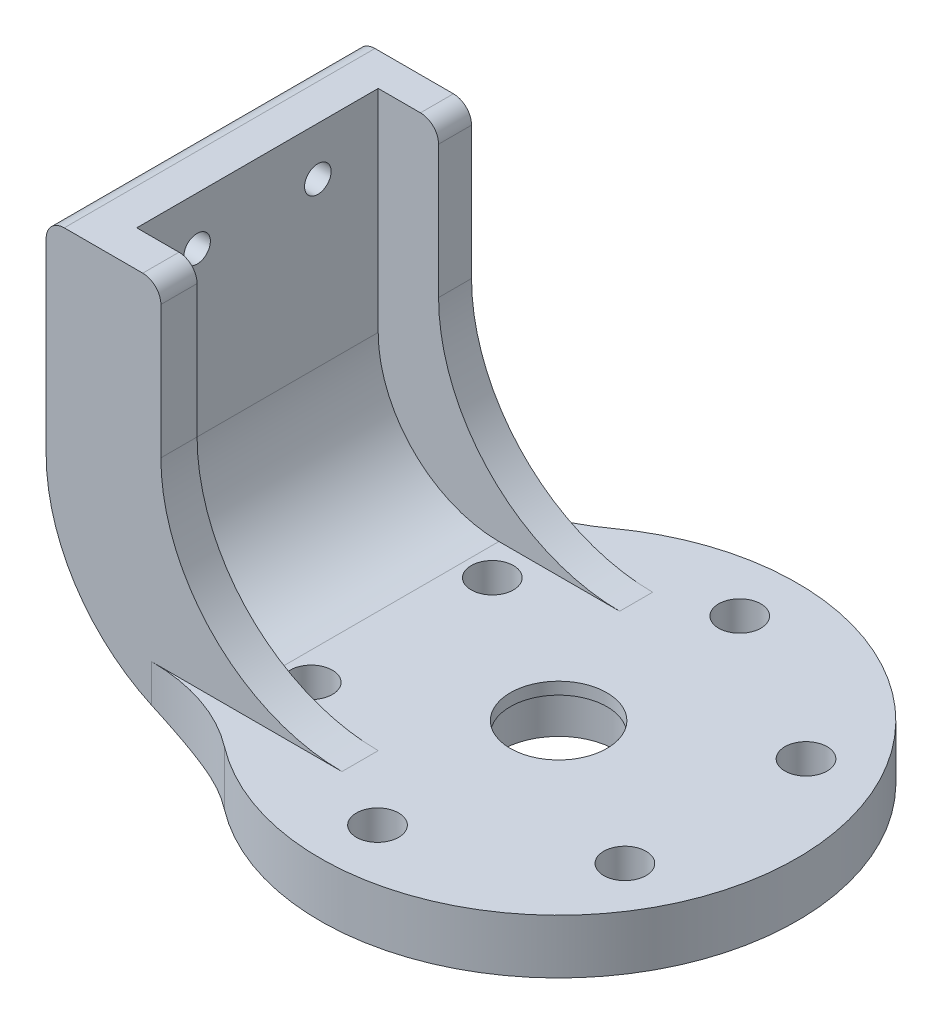
ISO-10303-21;
HEADER;
FILE_DESCRIPTION(('STEP AP214'),'2;1');
FILE_NAME('part.step','',(''),(''),'','','');
FILE_SCHEMA(('AUTOMOTIVE_DESIGN { 1 0 10303 214 1 1 1 1 }'));
ENDSEC;
DATA;
#1=APPLICATION_CONTEXT('core data for automotive mechanical design processes');
#2=APPLICATION_PROTOCOL_DEFINITION('international standard','automotive_design',2000,#1);
#3=PRODUCT_CONTEXT('',#1,'mechanical');
#4=PRODUCT('Part','Part','',(#3));
#5=PRODUCT_RELATED_PRODUCT_CATEGORY('part','',(#4));
#6=PRODUCT_DEFINITION_FORMATION('','',#4);
#7=PRODUCT_DEFINITION_CONTEXT('part definition',#1,'design');
#8=PRODUCT_DEFINITION('design','',#6,#7);
#9=PRODUCT_DEFINITION_SHAPE('','',#8);
#10=(LENGTH_UNIT() NAMED_UNIT(*) SI_UNIT(.MILLI.,.METRE.));
#11=(NAMED_UNIT(*) PLANE_ANGLE_UNIT() SI_UNIT($,.RADIAN.));
#12=(NAMED_UNIT(*) SI_UNIT($,.STERADIAN.) SOLID_ANGLE_UNIT());
#13=UNCERTAINTY_MEASURE_WITH_UNIT(LENGTH_MEASURE(1.E-05),#10,'distance_accuracy_value','');
#14=(GEOMETRIC_REPRESENTATION_CONTEXT(3) GLOBAL_UNCERTAINTY_ASSIGNED_CONTEXT((#13)) GLOBAL_UNIT_ASSIGNED_CONTEXT((#10,
#11,#12)) REPRESENTATION_CONTEXT('',''));
#15=CARTESIAN_POINT('',(0.,0.,0.));
#16=DIRECTION('',(0.,0.,1.));
#17=DIRECTION('',(1.,0.,0.));
#18=AXIS2_PLACEMENT_3D('',#15,#16,#17);
#19=CARTESIAN_POINT('',(45.9492279760976,9.,73.1158535405208));
#20=DIRECTION('',(0.,-1.,0.));
#21=DIRECTION('',(0.,0.,-1.));
#22=AXIS2_PLACEMENT_3D('',#19,#20,#21);
#23=CYLINDRICAL_SURFACE('',#22,9.52);
#24=CARTESIAN_POINT('',(45.9492279760976,0.,73.1158535405208));
#25=DIRECTION('',(0.,1.,0.));
#26=DIRECTION('',(0.,0.,1.));
#27=AXIS2_PLACEMENT_3D('',#24,#25,#26);
#28=CIRCLE('',#27,9.52);
#29=CARTESIAN_POINT('',(45.9492279760976,0.,82.6358535405208));
#30=VERTEX_POINT('',#29);
#31=EDGE_CURVE('E221',#30,#30,#28,.T.);
#32=ORIENTED_EDGE('',*,*,#31,.F.);
#33=EDGE_LOOP('',(#32));
#34=FACE_BOUND('',#33,.T.);
#35=CARTESIAN_POINT('',(45.9492279760976,7.,73.1158535405208));
#36=DIRECTION('',(0.,1.,0.));
#37=DIRECTION('',(0.,0.,1.));
#38=AXIS2_PLACEMENT_3D('',#35,#36,#37);
#39=CIRCLE('',#38,9.51999999999999);
#40=CARTESIAN_POINT('',(45.9492279760976,7.,82.6358535405208));
#41=VERTEX_POINT('',#40);
#42=EDGE_CURVE('E372',#41,#41,#39,.T.);
#43=ORIENTED_EDGE('',*,*,#42,.T.);
#44=EDGE_LOOP('',(#43));
#45=FACE_BOUND('',#44,.T.);
#46=ADVANCED_FACE('F34',(#34,#45),#23,.F.);
#47=CARTESIAN_POINT('',(3.79529264191499,9.,128.372488760558));
#48=DIRECTION('',(0.,-1.,0.));
#49=DIRECTION('',(0.,0.,-1.));
#50=AXIS2_PLACEMENT_3D('',#47,#48,#49);
#51=CYLINDRICAL_SURFACE('',#50,30.);
#52=DIRECTION('',(0.,-1.,0.));
#53=VECTOR('',#52,1.);
#54=CARTESIAN_POINT('',(3.79529264191499,9.,98.3724887605582));
#55=LINE('',#54,#53);
#56=CARTESIAN_POINT('',(3.79529264191499,9.,98.3724887605582));
#57=VERTEX_POINT('',#56);
#58=CARTESIAN_POINT('',(3.79529264191499,2.73958476161207,98.3724887605582));
#59=VERTEX_POINT('',#58);
#60=EDGE_CURVE('E225',#57,#59,#55,.T.);
#61=ORIENTED_EDGE('',*,*,#60,.T.);
#62=CARTESIAN_POINT('',(3.79529264191499,2.73958476161207,98.3724887605582));
#63=CARTESIAN_POINT('',(4.08212317001272,2.60779318026509,98.3724829941111));
#64=CARTESIAN_POINT('',(4.37104514995262,2.48053856169902,98.3766023291726));
#65=CARTESIAN_POINT('',(4.95256566151805,2.23528165272829,98.3934085599319));
#66=CARTESIAN_POINT('',(5.24516444303922,2.11727999519517,98.4060960410927));
#67=CARTESIAN_POINT('',(5.83359838933293,1.89068483693133,98.4403621543783));
#68=CARTESIAN_POINT('',(6.12943467748276,1.78209472650962,98.4619439745199));
#69=CARTESIAN_POINT('',(6.72362820041278,1.57452538424646,98.5142596795545));
#70=CARTESIAN_POINT('',(7.02198536010883,1.47554586724273,98.5449932927885));
#71=CARTESIAN_POINT('',(7.90489432426477,1.19793635092324,98.6494982864934));
#72=CARTESIAN_POINT('',(8.49227863878973,1.03288438237797,98.7364302103873));
#73=CARTESIAN_POINT('',(9.66948962433131,0.740168118970389,98.9471378247645));
#74=CARTESIAN_POINT('',(10.2593153739623,0.612490829120244,99.0709006790637));
#75=CARTESIAN_POINT('',(11.3081705297091,0.417908130600696,99.3245810629997));
#76=CARTESIAN_POINT('',(11.7676440231811,0.343820640765705,99.4472568020468));
#77=CARTESIAN_POINT('',(12.6829993440016,0.217702595368154,99.7152716444943));
#78=CARTESIAN_POINT('',(13.1388812271756,0.165671696306767,99.8606103949035));
#79=CARTESIAN_POINT('',(14.0540024531109,0.0821088691003242,100.176783994745));
#80=CARTESIAN_POINT('',(14.5131237731802,0.0510119886438955,100.348074333651));
#81=CARTESIAN_POINT('',(15.4232178697208,0.00993898451727821,100.713268494247));
#82=CARTESIAN_POINT('',(15.8741911816049,-3.85319663760539E-05,100.907170823797));
#83=CARTESIAN_POINT('',(16.3200585491353,0.,101.11207352217));
#84=B_SPLINE_CURVE_WITH_KNOTS('',3,(#62,#63,#64,#65,#66,#67,#68,#69,#70,#71,#72,#73,#74,#75,#76,
#77,#78,#79,#80,#81,#82,#83),.UNSPECIFIED.,.F.,.F.,(4,2,2,2,2,2,2,2,2,2,4),(0.,
0.946919297964487,1.89390330564701,2.84122703843126,3.788522653951,5.63502311975776,
7.48088080197917,8.92377794619328,10.3666526185896,11.8386566190141,13.3105635383484),.UNSPECIFIED.);
#85=CARTESIAN_POINT('',(16.3200585491353,0.,101.11207352217));
#86=VERTEX_POINT('',#85);
#87=EDGE_CURVE('E315',#59,#86,#84,.T.);
#88=ORIENTED_EDGE('',*,*,#87,.T.);
#89=CARTESIAN_POINT('',(3.79529264191499,0.,128.372488760558));
#90=DIRECTION('',(0.,1.,0.));
#91=DIRECTION('',(0.,0.,1.));
#92=AXIS2_PLACEMENT_3D('',#89,#90,#91);
#93=CIRCLE('',#92,30.);
#94=CARTESIAN_POINT('',(21.9912359516365,0.,104.520703773489));
#95=VERTEX_POINT('',#94);
#96=EDGE_CURVE('E216',#95,#86,#93,.T.);
#97=ORIENTED_EDGE('',*,*,#96,.F.);
#98=DIRECTION('',(0.,-1.,0.));
#99=VECTOR('',#98,1.);
#100=CARTESIAN_POINT('',(21.9912359516365,9.,104.520703773489));
#101=LINE('',#100,#99);
#102=CARTESIAN_POINT('',(21.9912359516365,9.,104.520703773489));
#103=VERTEX_POINT('',#102);
#104=EDGE_CURVE('E200',#103,#95,#101,.T.);
#105=ORIENTED_EDGE('',*,*,#104,.F.);
#106=CARTESIAN_POINT('',(3.79529264191499,9.,128.372488760558));
#107=DIRECTION('',(0.,1.,0.));
#108=DIRECTION('',(0.,0.,1.));
#109=AXIS2_PLACEMENT_3D('',#106,#107,#108);
#110=CIRCLE('',#109,30.);
#111=EDGE_CURVE('E217',#103,#57,#110,.T.);
#112=ORIENTED_EDGE('',*,*,#111,.T.);
#113=EDGE_LOOP('',(#61,#88,#97,#105,#112));
#114=FACE_BOUND('',#113,.T.);
#115=ADVANCED_FACE('F306',(#114),#51,.F.);
#116=CARTESIAN_POINT('',(45.9492279760976,9.,73.1158535405208));
#117=DIRECTION('',(0.,-1.,0.));
#118=DIRECTION('',(0.,0.,-1.));
#119=AXIS2_PLACEMENT_3D('',#116,#117,#118);
#120=CYLINDRICAL_SURFACE('',#119,39.4999999999908);
#121=CARTESIAN_POINT('',(45.9492279760976,0.,73.1158535405208));
#122=DIRECTION('',(0.,1.,0.));
#123=DIRECTION('',(0.,0.,1.));
#124=AXIS2_PLACEMENT_3D('',#121,#122,#123);
#125=CIRCLE('',#124,39.4999999999908);
#126=CARTESIAN_POINT('',(22.7153108427455,0.,41.1716037506164));
#127=VERTEX_POINT('',#126);
#128=EDGE_CURVE('E228',#95,#127,#125,.T.);
#129=ORIENTED_EDGE('',*,*,#128,.T.);
#130=DIRECTION('',(0.,-1.,0.));
#131=VECTOR('',#130,1.);
#132=CARTESIAN_POINT('',(22.7153108427455,9.,41.1716037506164));
#133=LINE('',#132,#131);
#134=CARTESIAN_POINT('',(22.7153108427455,9.,41.1716037506164));
#135=VERTEX_POINT('',#134);
#136=EDGE_CURVE('E244',#135,#127,#133,.T.);
#137=ORIENTED_EDGE('',*,*,#136,.F.);
#138=CARTESIAN_POINT('',(45.9492279760976,9.,73.1158535405208));
#139=DIRECTION('',(0.,1.,0.));
#140=DIRECTION('',(0.,0.,1.));
#141=AXIS2_PLACEMENT_3D('',#138,#139,#140);
#142=CIRCLE('',#141,39.4999999999908);
#143=EDGE_CURVE('E220',#103,#135,#142,.T.);
#144=ORIENTED_EDGE('',*,*,#143,.F.);
#145=ORIENTED_EDGE('',*,*,#104,.T.);
#146=EDGE_LOOP('',(#129,#137,#144,#145));
#147=FACE_BOUND('',#146,.T.);
#148=ADVANCED_FACE('F301',(#147),#120,.T.);
#149=CARTESIAN_POINT('',(5.06929783006886,9.,16.9101482139746));
#150=DIRECTION('',(0.,-1.,0.));
#151=DIRECTION('',(0.,0.,-1.));
#152=AXIS2_PLACEMENT_3D('',#149,#150,#151);
#153=CYLINDRICAL_SURFACE('',#152,30.);
#154=CARTESIAN_POINT('',(5.06929783006886,0.,16.9101482139746));
#155=DIRECTION('',(0.,1.,0.));
#156=DIRECTION('',(0.,0.,1.));
#157=AXIS2_PLACEMENT_3D('',#154,#155,#156);
#158=CIRCLE('',#157,30.);
#159=CARTESIAN_POINT('',(16.3200585491353,0.,44.7205848024626));
#160=VERTEX_POINT('',#159);
#161=EDGE_CURVE('E230',#127,#160,#158,.F.);
#162=ORIENTED_EDGE('',*,*,#161,.T.);
#163=CARTESIAN_POINT('',(16.3200585491353,0.,44.7205848024626));
#164=CARTESIAN_POINT('',(16.0303772510127,-6.10866229432289E-06,44.8377834352283));
#165=CARTESIAN_POINT('',(15.7388546475405,0.00419572042793232,44.9504450216047));
#166=CARTESIAN_POINT('',(15.1526416994677,0.0212903135662298,45.1665397020865));
#167=CARTESIAN_POINT('',(14.8579511606892,0.0341836133796934,45.2699722268428));
#168=CARTESIAN_POINT('',(14.2658335496683,0.0689432916229645,45.4674797585722));
#169=CARTESIAN_POINT('',(13.9684054205856,0.0908132908442439,45.561550970573));
#170=CARTESIAN_POINT('',(13.3715418801136,0.143743515662686,45.7401642093106));
#171=CARTESIAN_POINT('',(13.0721065283932,0.174803469242807,45.8247065179949));
#172=CARTESIAN_POINT('',(12.1851389942991,0.280455177399822,46.0603301386952));
#173=CARTESIAN_POINT('',(11.5954769211261,0.368297351035106,46.1978815869031));
#174=CARTESIAN_POINT('',(10.4156001881332,0.580678026048685,46.4360542820999));
#175=CARTESIAN_POINT('',(9.82538589780021,0.705199948239401,46.5366921679173));
#176=CARTESIAN_POINT('',(8.88689450454277,0.933211238148347,46.6683615180891));
#177=CARTESIAN_POINT('',(8.53729703559168,1.02484336870942,46.7110837758843));
#178=CARTESIAN_POINT('',(7.8404657795513,1.22105865387952,46.7839375632547));
#179=CARTESIAN_POINT('',(7.49323166692707,1.32563998512021,46.8140708628649));
#180=CARTESIAN_POINT('',(6.79730434534592,1.54912130588885,46.8623982873285));
#181=CARTESIAN_POINT('',(6.44865615916769,1.66819760447331,46.8804234434798));
#182=CARTESIAN_POINT('',(5.75558019241474,1.91926143034799,46.9043051803117));
#183=CARTESIAN_POINT('',(5.41115279136364,2.05125010924336,46.9101606745895));
#184=CARTESIAN_POINT('',(5.06929783006844,2.18956341151216,46.9101482139746));
#185=B_SPLINE_CURVE_WITH_KNOTS('',3,(#163,#164,#165,#166,#167,#168,#169,#170,#171,#172,#173,
#174,#175,#176,#177,#178,#179,#180,#181,#182,#183,#184),.UNSPECIFIED.,.F.,.F.,(4,2,2,2,2,2,2,2,
2,2,4),(0.,0.937413719174226,1.87488522831024,2.81273524290374,3.75055750048566,
5.58370271831508,7.41602062554984,8.50738213124042,9.5985901374314,10.7047260036722,
11.8109606119762),.UNSPECIFIED.);
#186=CARTESIAN_POINT('',(5.06929783006844,2.18956341151216,46.9101482139746));
#187=VERTEX_POINT('',#186);
#188=EDGE_CURVE('E281',#160,#187,#185,.T.);
#189=ORIENTED_EDGE('',*,*,#188,.T.);
#190=DIRECTION('',(0.,-1.,0.));
#191=VECTOR('',#190,1.);
#192=CARTESIAN_POINT('',(5.06929783006844,9.,46.9101482139746));
#193=LINE('',#192,#191);
#194=CARTESIAN_POINT('',(5.06929783006844,9.,46.9101482139746));
#195=VERTEX_POINT('',#194);
#196=EDGE_CURVE('E241',#195,#187,#193,.T.);
#197=ORIENTED_EDGE('',*,*,#196,.F.);
#198=CARTESIAN_POINT('',(5.06929783006886,9.,16.9101482139746));
#199=DIRECTION('',(0.,1.,0.));
#200=DIRECTION('',(0.,0.,1.));
#201=AXIS2_PLACEMENT_3D('',#198,#199,#200);
#202=CIRCLE('',#201,30.);
#203=EDGE_CURVE('E223',#135,#195,#202,.F.);
#204=ORIENTED_EDGE('',*,*,#203,.F.);
#205=ORIENTED_EDGE('',*,*,#136,.T.);
#206=EDGE_LOOP('',(#162,#189,#197,#204,#205));
#207=FACE_BOUND('',#206,.T.);
#208=ADVANCED_FACE('F295',(#207),#153,.F.);
#209=CARTESIAN_POINT('',(-6.42355023265449E-13,9.,46.9101482139745));
#210=DIRECTION('',(0.,0.,-1.));
#211=DIRECTION('',(-1.,0.,0.));
#212=AXIS2_PLACEMENT_3D('',#209,#210,#211);
#213=PLANE('',#212);
#214=DIRECTION('',(-1.,0.,0.));
#215=VECTOR('',#214,1.);
#216=CARTESIAN_POINT('',(-4.67994145086473,64.,46.9101482139743));
#217=LINE('',#216,#215);
#218=CARTESIAN_POINT('',(2.32005854913527,64.,46.9101482139743));
#219=VERTEX_POINT('',#218);
#220=CARTESIAN_POINT('',(-10.6799414508647,64.,46.9101482139743));
#221=VERTEX_POINT('',#220);
#222=EDGE_CURVE('E190',#219,#221,#217,.T.);
#223=ORIENTED_EDGE('',*,*,#222,.F.);
#224=CARTESIAN_POINT('',(2.32005854913527,61.,46.9101482139745));
#225=DIRECTION('',(0.,0.,-1.));
#226=DIRECTION('',(-1.,0.,0.));
#227=AXIS2_PLACEMENT_3D('',#224,#225,#226);
#228=CIRCLE('',#227,3.);
#229=CARTESIAN_POINT('',(5.32005854913527,61.,46.9101482139743));
#230=VERTEX_POINT('',#229);
#231=EDGE_CURVE('E332',#219,#230,#228,.T.);
#232=ORIENTED_EDGE('',*,*,#231,.T.);
#233=DIRECTION('',(0.,-1.,0.));
#234=VECTOR('',#233,1.);
#235=CARTESIAN_POINT('',(5.32005854913527,64.,46.9101482139743));
#236=LINE('',#235,#234);
#237=CARTESIAN_POINT('',(5.32005854913527,39.,46.9101482139743));
#238=VERTEX_POINT('',#237);
#239=EDGE_CURVE('E196',#230,#238,#236,.T.);
#240=ORIENTED_EDGE('',*,*,#239,.T.);
#241=CARTESIAN_POINT('',(35.3200585491353,39.,46.910148213975));
#242=DIRECTION('',(0.,0.,-1.));
#243=DIRECTION('',(-1.,0.,0.));
#244=AXIS2_PLACEMENT_3D('',#241,#242,#243);
#245=CIRCLE('',#244,30.);
#246=CARTESIAN_POINT('',(35.3200585491353,9.,46.9101482139743));
#247=VERTEX_POINT('',#246);
#248=EDGE_CURVE('E265',#238,#247,#245,.F.);
#249=ORIENTED_EDGE('',*,*,#248,.T.);
#250=DIRECTION('',(-1.,0.,0.));
#251=VECTOR('',#250,1.);
#252=CARTESIAN_POINT('',(-13.6799414508647,9.,46.9101482139743));
#253=LINE('',#252,#251);
#254=EDGE_CURVE('E206',#247,#195,#253,.T.);
#255=ORIENTED_EDGE('',*,*,#254,.T.);
#256=ORIENTED_EDGE('',*,*,#196,.T.);
#257=CARTESIAN_POINT('',(16.3200585491353,30.,46.9101482139747));
#258=DIRECTION('',(0.,0.,-1.));
#259=DIRECTION('',(-1.,0.,0.));
#260=AXIS2_PLACEMENT_3D('',#257,#258,#259);
#261=CIRCLE('',#260,30.);
#262=CARTESIAN_POINT('',(-13.6799414508647,30.,46.9101482139743));
#263=VERTEX_POINT('',#262);
#264=EDGE_CURVE('E289',#187,#263,#261,.T.);
#265=ORIENTED_EDGE('',*,*,#264,.T.);
#266=DIRECTION('',(0.,-1.,0.));
#267=VECTOR('',#266,1.);
#268=CARTESIAN_POINT('',(-13.6799414508647,9.,46.9101482139743));
#269=LINE('',#268,#267);
#270=CARTESIAN_POINT('',(-13.6799414508647,61.,46.9101482139743));
#271=VERTEX_POINT('',#270);
#272=EDGE_CURVE('E239',#271,#263,#269,.T.);
#273=ORIENTED_EDGE('',*,*,#272,.F.);
#274=CARTESIAN_POINT('',(-10.6799414508647,61.,46.9101482139744));
#275=DIRECTION('',(0.,0.,-1.));
#276=DIRECTION('',(-1.,0.,0.));
#277=AXIS2_PLACEMENT_3D('',#274,#275,#276);
#278=CIRCLE('',#277,3.);
#279=EDGE_CURVE('E330',#271,#221,#278,.T.);
#280=ORIENTED_EDGE('',*,*,#279,.T.);
#281=EDGE_LOOP('',(#223,#232,#240,#249,#255,#256,#265,#273,#280));
#282=FACE_BOUND('',#281,.T.);
#283=ADVANCED_FACE('F300',(#282),#213,.T.);
#284=CARTESIAN_POINT('',(-13.6799414508647,9.,0.));
#285=DIRECTION('',(-1.,0.,0.));
#286=DIRECTION('',(0.,0.,1.));
#287=AXIS2_PLACEMENT_3D('',#284,#285,#286);
#288=PLANE('',#287);
#289=CARTESIAN_POINT('',(-13.6799414508647,56.,82.3724887605582));
#290=DIRECTION('',(-1.,0.,0.));
#291=DIRECTION('',(0.,0.,1.));
#292=AXIS2_PLACEMENT_3D('',#289,#290,#291);
#293=CIRCLE('',#292,2.2);
#294=CARTESIAN_POINT('',(-13.6799414508647,56.,84.5724887605582));
#295=VERTEX_POINT('',#294);
#296=EDGE_CURVE('E204',#295,#295,#293,.T.);
#297=ORIENTED_EDGE('',*,*,#296,.F.);
#298=EDGE_LOOP('',(#297));
#299=FACE_BOUND('',#298,.T.);
#300=CARTESIAN_POINT('',(-13.6799414508647,56.,62.3724887605582));
#301=DIRECTION('',(-1.,0.,0.));
#302=DIRECTION('',(0.,0.,1.));
#303=AXIS2_PLACEMENT_3D('',#300,#301,#302);
#304=CIRCLE('',#303,2.2);
#305=CARTESIAN_POINT('',(-13.6799414508647,56.,64.5724887605582));
#306=VERTEX_POINT('',#305);
#307=EDGE_CURVE('E365',#306,#306,#304,.T.);
#308=ORIENTED_EDGE('',*,*,#307,.F.);
#309=EDGE_LOOP('',(#308));
#310=FACE_BOUND('',#309,.T.);
#311=DIRECTION('',(0.,-1.,0.));
#312=VECTOR('',#311,1.);
#313=CARTESIAN_POINT('',(-13.6799414508647,9.,98.3724887605582));
#314=LINE('',#313,#312);
#315=CARTESIAN_POINT('',(-13.6799414508647,61.,98.3724887605582));
#316=VERTEX_POINT('',#315);
#317=CARTESIAN_POINT('',(-13.6799414508647,30.,98.3724887605582));
#318=VERTEX_POINT('',#317);
#319=EDGE_CURVE('E237',#316,#318,#314,.T.);
#320=ORIENTED_EDGE('',*,*,#319,.F.);
#321=DIRECTION('',(0.,0.,1.));
#322=VECTOR('',#321,1.);
#323=CARTESIAN_POINT('',(-13.6799414508647,61.,0.));
#324=LINE('',#323,#322);
#325=EDGE_CURVE('E342',#316,#271,#324,.F.);
#326=ORIENTED_EDGE('',*,*,#325,.T.);
#327=ORIENTED_EDGE('',*,*,#272,.T.);
#328=DIRECTION('',(0.,0.,-1.));
#329=VECTOR('',#328,1.);
#330=CARTESIAN_POINT('',(-13.6799414508647,30.,98.3724887605582));
#331=LINE('',#330,#329);
#332=EDGE_CURVE('E655',#263,#318,#331,.F.);
#333=ORIENTED_EDGE('',*,*,#332,.T.);
#334=EDGE_LOOP('',(#320,#326,#327,#333));
#335=FACE_BOUND('',#334,.T.);
#336=ADVANCED_FACE('F347',(#299,#310,#335),#288,.T.);
#337=CARTESIAN_POINT('',(0.,9.,98.3724887605582));
#338=DIRECTION('',(0.,0.,-1.));
#339=DIRECTION('',(-1.,0.,0.));
#340=AXIS2_PLACEMENT_3D('',#337,#338,#339);
#341=PLANE('',#340);
#342=DIRECTION('',(1.,0.,0.));
#343=VECTOR('',#342,1.);
#344=CARTESIAN_POINT('',(-13.6799414508647,64.,98.3724887605582));
#345=LINE('',#344,#343);
#346=CARTESIAN_POINT('',(-10.6799414508647,64.,98.3724887605582));
#347=VERTEX_POINT('',#346);
#348=CARTESIAN_POINT('',(2.32005854913527,64.,98.3724887605582));
#349=VERTEX_POINT('',#348);
#350=EDGE_CURVE('E171',#347,#349,#345,.T.);
#351=ORIENTED_EDGE('',*,*,#350,.F.);
#352=CARTESIAN_POINT('',(-10.6799414508647,61.,98.3724887605582));
#353=DIRECTION('',(0.,0.,-1.));
#354=DIRECTION('',(-1.,0.,0.));
#355=AXIS2_PLACEMENT_3D('',#352,#353,#354);
#356=CIRCLE('',#355,3.);
#357=EDGE_CURVE('E340',#347,#316,#356,.F.);
#358=ORIENTED_EDGE('',*,*,#357,.T.);
#359=ORIENTED_EDGE('',*,*,#319,.T.);
#360=CARTESIAN_POINT('',(16.3200585491353,30.,98.3724887605582));
#361=DIRECTION('',(0.,0.,-1.));
#362=DIRECTION('',(-1.,0.,0.));
#363=AXIS2_PLACEMENT_3D('',#360,#361,#362);
#364=CIRCLE('',#363,30.);
#365=EDGE_CURVE('E322',#318,#59,#364,.F.);
#366=ORIENTED_EDGE('',*,*,#365,.T.);
#367=ORIENTED_EDGE('',*,*,#60,.F.);
#368=DIRECTION('',(1.,0.,0.));
#369=VECTOR('',#368,1.);
#370=CARTESIAN_POINT('',(-4.67994145086473,9.,98.3724887605582));
#371=LINE('',#370,#369);
#372=CARTESIAN_POINT('',(35.3200585491353,9.,98.3724887605582));
#373=VERTEX_POINT('',#372);
#374=EDGE_CURVE('E197',#57,#373,#371,.T.);
#375=ORIENTED_EDGE('',*,*,#374,.T.);
#376=CARTESIAN_POINT('',(35.3200585491353,39.,98.3724887605582));
#377=DIRECTION('',(0.,0.,-1.));
#378=DIRECTION('',(-1.,0.,0.));
#379=AXIS2_PLACEMENT_3D('',#376,#377,#378);
#380=CIRCLE('',#379,30.);
#381=CARTESIAN_POINT('',(5.32005854913527,39.,98.3724887605582));
#382=VERTEX_POINT('',#381);
#383=EDGE_CURVE('E262',#373,#382,#380,.T.);
#384=ORIENTED_EDGE('',*,*,#383,.T.);
#385=DIRECTION('',(0.,-1.,0.));
#386=VECTOR('',#385,1.);
#387=CARTESIAN_POINT('',(5.32005854913527,64.,98.3724887605582));
#388=LINE('',#387,#386);
#389=CARTESIAN_POINT('',(5.32005854913527,61.,98.3724887605582));
#390=VERTEX_POINT('',#389);
#391=EDGE_CURVE('E214',#390,#382,#388,.T.);
#392=ORIENTED_EDGE('',*,*,#391,.F.);
#393=CARTESIAN_POINT('',(2.32005854913527,61.,98.3724887605582));
#394=DIRECTION('',(0.,0.,-1.));
#395=DIRECTION('',(-1.,0.,0.));
#396=AXIS2_PLACEMENT_3D('',#393,#394,#395);
#397=CIRCLE('',#396,3.);
#398=EDGE_CURVE('E338',#390,#349,#397,.F.);
#399=ORIENTED_EDGE('',*,*,#398,.T.);
#400=EDGE_LOOP('',(#351,#358,#359,#366,#367,#375,#384,#392,#399));
#401=FACE_BOUND('',#400,.T.);
#402=ADVANCED_FACE('F360',(#401),#341,.F.);
#403=CARTESIAN_POINT('',(0.,9.,0.));
#404=DIRECTION('',(0.,1.,0.));
#405=DIRECTION('',(0.,0.,1.));
#406=AXIS2_PLACEMENT_3D('',#403,#404,#405);
#407=PLANE('',#406);
#408=CARTESIAN_POINT('',(19.9684658625652,9.,58.1158535405209));
#409=DIRECTION('',(0.,1.,0.));
#410=DIRECTION('',(0.,0.,1.));
#411=AXIS2_PLACEMENT_3D('',#408,#409,#410);
#412=CIRCLE('',#411,3.5);
#413=CARTESIAN_POINT('',(19.9684658625652,9.,61.6158535405209));
#414=VERTEX_POINT('',#413);
#415=EDGE_CURVE('E381',#414,#414,#412,.T.);
#416=ORIENTED_EDGE('',*,*,#415,.F.);
#417=EDGE_LOOP('',(#416));
#418=FACE_BOUND('',#417,.T.);
#419=CARTESIAN_POINT('',(45.9492279760977,9.,43.1158535405208));
#420=DIRECTION('',(0.,1.,0.));
#421=DIRECTION('',(0.,0.,1.));
#422=AXIS2_PLACEMENT_3D('',#419,#420,#421);
#423=CIRCLE('',#422,3.49999999999979);
#424=CARTESIAN_POINT('',(45.9492279760977,9.,46.6158535405206));
#425=VERTEX_POINT('',#424);
#426=EDGE_CURVE('E386',#425,#425,#423,.T.);
#427=ORIENTED_EDGE('',*,*,#426,.F.);
#428=EDGE_LOOP('',(#427));
#429=FACE_BOUND('',#428,.T.);
#430=CARTESIAN_POINT('',(71.9299900896308,9.,58.1158535405209));
#431=DIRECTION('',(0.,1.,0.));
#432=DIRECTION('',(0.,0.,1.));
#433=AXIS2_PLACEMENT_3D('',#430,#431,#432);
#434=CIRCLE('',#433,3.49999999999891);
#435=CARTESIAN_POINT('',(71.9299900896308,9.,61.6158535405198));
#436=VERTEX_POINT('',#435);
#437=EDGE_CURVE('E389',#436,#436,#434,.T.);
#438=ORIENTED_EDGE('',*,*,#437,.F.);
#439=EDGE_LOOP('',(#438));
#440=FACE_BOUND('',#439,.T.);
#441=CARTESIAN_POINT('',(71.9299900896306,9.,88.1158535405209));
#442=DIRECTION('',(0.,1.,0.));
#443=DIRECTION('',(0.,0.,1.));
#444=AXIS2_PLACEMENT_3D('',#441,#442,#443);
#445=CIRCLE('',#444,3.49999999999869);
#446=CARTESIAN_POINT('',(71.9299900896306,9.,91.6158535405196));
#447=VERTEX_POINT('',#446);
#448=EDGE_CURVE('E392',#447,#447,#445,.T.);
#449=ORIENTED_EDGE('',*,*,#448,.F.);
#450=EDGE_LOOP('',(#449));
#451=FACE_BOUND('',#450,.T.);
#452=CARTESIAN_POINT('',(45.949227976097,9.,103.115853540522));
#453=DIRECTION('',(0.,1.,0.));
#454=DIRECTION('',(0.,0.,1.));
#455=AXIS2_PLACEMENT_3D('',#452,#453,#454);
#456=CIRCLE('',#455,3.5);
#457=CARTESIAN_POINT('',(45.949227976097,9.,106.615853540522));
#458=VERTEX_POINT('',#457);
#459=EDGE_CURVE('E395',#458,#458,#456,.T.);
#460=ORIENTED_EDGE('',*,*,#459,.F.);
#461=EDGE_LOOP('',(#460));
#462=FACE_BOUND('',#461,.T.);
#463=CARTESIAN_POINT('',(19.9684658625643,9.,88.1158535405206));
#464=DIRECTION('',(0.,1.,0.));
#465=DIRECTION('',(0.,0.,1.));
#466=AXIS2_PLACEMENT_3D('',#463,#464,#465);
#467=CIRCLE('',#466,3.5);
#468=CARTESIAN_POINT('',(19.9684658625643,9.,91.6158535405206));
#469=VERTEX_POINT('',#468);
#470=EDGE_CURVE('E398',#469,#469,#467,.T.);
#471=ORIENTED_EDGE('',*,*,#470,.F.);
#472=EDGE_LOOP('',(#471));
#473=FACE_BOUND('',#472,.T.);
#474=DIRECTION('',(1.,0.,0.));
#475=VECTOR('',#474,1.);
#476=CARTESIAN_POINT('',(-4.67994145086474,9.,52.3724887605582));
#477=LINE('',#476,#475);
#478=CARTESIAN_POINT('',(15.3200585491353,9.,52.3724887605582));
#479=VERTEX_POINT('',#478);
#480=CARTESIAN_POINT('',(35.3200585491353,9.,52.3724887605582));
#481=VERTEX_POINT('',#480);
#482=EDGE_CURVE('E203',#479,#481,#477,.T.);
#483=ORIENTED_EDGE('',*,*,#482,.F.);
#484=DIRECTION('',(0.,0.,-1.));
#485=VECTOR('',#484,1.);
#486=CARTESIAN_POINT('',(15.3200585491353,9.,0.));
#487=LINE('',#486,#485);
#488=CARTESIAN_POINT('',(15.3200585491353,9.,92.3724887605582));
#489=VERTEX_POINT('',#488);
#490=EDGE_CURVE('E275',#479,#489,#487,.F.);
#491=ORIENTED_EDGE('',*,*,#490,.T.);
#492=DIRECTION('',(-1.,0.,0.));
#493=VECTOR('',#492,1.);
#494=CARTESIAN_POINT('',(-4.67994145086473,9.,92.3724887605582));
#495=LINE('',#494,#493);
#496=CARTESIAN_POINT('',(35.3200585491353,9.,92.3724887605582));
#497=VERTEX_POINT('',#496);
#498=EDGE_CURVE('E201',#497,#489,#495,.T.);
#499=ORIENTED_EDGE('',*,*,#498,.F.);
#500=DIRECTION('',(0.,0.,-1.));
#501=VECTOR('',#500,1.);
#502=CARTESIAN_POINT('',(35.3200585491353,9.,0.));
#503=LINE('',#502,#501);
#504=EDGE_CURVE('E253',#497,#373,#503,.F.);
#505=ORIENTED_EDGE('',*,*,#504,.T.);
#506=ORIENTED_EDGE('',*,*,#374,.F.);
#507=ORIENTED_EDGE('',*,*,#111,.F.);
#508=ORIENTED_EDGE('',*,*,#143,.T.);
#509=ORIENTED_EDGE('',*,*,#203,.T.);
#510=ORIENTED_EDGE('',*,*,#254,.F.);
#511=DIRECTION('',(0.,0.,-1.));
#512=VECTOR('',#511,1.);
#513=CARTESIAN_POINT('',(35.3200585491353,9.,0.));
#514=LINE('',#513,#512);
#515=EDGE_CURVE('E250',#247,#481,#514,.F.);
#516=ORIENTED_EDGE('',*,*,#515,.T.);
#517=EDGE_LOOP('',(#483,#491,#499,#505,#506,#507,#508,#509,#510,#516));
#518=FACE_BOUND('',#517,.T.);
#519=CARTESIAN_POINT('',(45.9492279760976,9.,73.1158535405208));
#520=DIRECTION('',(0.,1.,0.));
#521=DIRECTION('',(0.,0.,1.));
#522=AXIS2_PLACEMENT_3D('',#519,#520,#521);
#523=CIRCLE('',#522,8.);
#524=CARTESIAN_POINT('',(45.9492279760976,9.,81.1158535405208));
#525=VERTEX_POINT('',#524);
#526=EDGE_CURVE('E378',#525,#525,#523,.T.);
#527=ORIENTED_EDGE('',*,*,#526,.F.);
#528=EDGE_LOOP('',(#527));
#529=FACE_BOUND('',#528,.T.);
#530=ADVANCED_FACE('F426',(#418,#429,#440,#451,#462,#473,#518,#529),#407,.T.);
#531=CARTESIAN_POINT('',(0.,0.,0.));
#532=DIRECTION('',(0.,1.,0.));
#533=DIRECTION('',(0.,0.,1.));
#534=AXIS2_PLACEMENT_3D('',#531,#532,#533);
#535=PLANE('',#534);
#536=CARTESIAN_POINT('',(19.9684658625652,0.,58.1158535405209));
#537=DIRECTION('',(0.,-1.,0.));
#538=DIRECTION('',(0.,0.,-1.));
#539=AXIS2_PLACEMENT_3D('',#536,#537,#538);
#540=CIRCLE('',#539,3.5);
#541=CARTESIAN_POINT('',(19.9684658625652,0.,54.6158535405209));
#542=VERTEX_POINT('',#541);
#543=EDGE_CURVE('E405',#542,#542,#540,.T.);
#544=ORIENTED_EDGE('',*,*,#543,.F.);
#545=EDGE_LOOP('',(#544));
#546=FACE_BOUND('',#545,.T.);
#547=CARTESIAN_POINT('',(45.9492279760977,0.,43.1158535405208));
#548=DIRECTION('',(0.,-1.,0.));
#549=DIRECTION('',(0.,0.,-1.));
#550=AXIS2_PLACEMENT_3D('',#547,#548,#549);
#551=CIRCLE('',#550,3.49999999999979);
#552=CARTESIAN_POINT('',(45.9492279760977,0.,39.615853540521));
#553=VERTEX_POINT('',#552);
#554=EDGE_CURVE('E408',#553,#553,#551,.T.);
#555=ORIENTED_EDGE('',*,*,#554,.F.);
#556=EDGE_LOOP('',(#555));
#557=FACE_BOUND('',#556,.T.);
#558=CARTESIAN_POINT('',(71.9299900896308,0.,58.1158535405209));
#559=DIRECTION('',(0.,-1.,0.));
#560=DIRECTION('',(0.,0.,-1.));
#561=AXIS2_PLACEMENT_3D('',#558,#559,#560);
#562=CIRCLE('',#561,3.49999999999891);
#563=CARTESIAN_POINT('',(71.9299900896308,0.,54.615853540522));
#564=VERTEX_POINT('',#563);
#565=EDGE_CURVE('E411',#564,#564,#562,.T.);
#566=ORIENTED_EDGE('',*,*,#565,.F.);
#567=EDGE_LOOP('',(#566));
#568=FACE_BOUND('',#567,.T.);
#569=CARTESIAN_POINT('',(71.9299900896306,0.,88.1158535405209));
#570=DIRECTION('',(0.,-1.,0.));
#571=DIRECTION('',(0.,0.,-1.));
#572=AXIS2_PLACEMENT_3D('',#569,#570,#571);
#573=CIRCLE('',#572,3.49999999999869);
#574=CARTESIAN_POINT('',(71.9299900896306,0.,84.6158535405223));
#575=VERTEX_POINT('',#574);
#576=EDGE_CURVE('E414',#575,#575,#573,.T.);
#577=ORIENTED_EDGE('',*,*,#576,.F.);
#578=EDGE_LOOP('',(#577));
#579=FACE_BOUND('',#578,.T.);
#580=CARTESIAN_POINT('',(45.949227976097,0.,103.115853540522));
#581=DIRECTION('',(0.,-1.,0.));
#582=DIRECTION('',(0.,0.,-1.));
#583=AXIS2_PLACEMENT_3D('',#580,#581,#582);
#584=CIRCLE('',#583,3.5);
#585=CARTESIAN_POINT('',(45.949227976097,0.,99.6158535405215));
#586=VERTEX_POINT('',#585);
#587=EDGE_CURVE('E404',#586,#586,#584,.T.);
#588=ORIENTED_EDGE('',*,*,#587,.F.);
#589=EDGE_LOOP('',(#588));
#590=FACE_BOUND('',#589,.T.);
#591=CARTESIAN_POINT('',(19.9684658625643,0.,88.1158535405206));
#592=DIRECTION('',(0.,-1.,0.));
#593=DIRECTION('',(0.,0.,-1.));
#594=AXIS2_PLACEMENT_3D('',#591,#592,#593);
#595=CIRCLE('',#594,3.5);
#596=CARTESIAN_POINT('',(19.9684658625643,0.,84.6158535405206));
#597=VERTEX_POINT('',#596);
#598=EDGE_CURVE('E401',#597,#597,#595,.T.);
#599=ORIENTED_EDGE('',*,*,#598,.F.);
#600=EDGE_LOOP('',(#599));
#601=FACE_BOUND('',#600,.T.);
#602=ORIENTED_EDGE('',*,*,#96,.T.);
#603=DIRECTION('',(0.,0.,-1.));
#604=VECTOR('',#603,1.);
#605=CARTESIAN_POINT('',(16.3200585491353,0.,46.9101482139743));
#606=LINE('',#605,#604);
#607=EDGE_CURVE('E278',#86,#160,#606,.T.);
#608=ORIENTED_EDGE('',*,*,#607,.T.);
#609=ORIENTED_EDGE('',*,*,#161,.F.);
#610=ORIENTED_EDGE('',*,*,#128,.F.);
#611=EDGE_LOOP('',(#602,#608,#609,#610));
#612=FACE_BOUND('',#611,.T.);
#613=ORIENTED_EDGE('',*,*,#31,.T.);
#614=EDGE_LOOP('',(#613));
#615=FACE_BOUND('',#614,.T.);
#616=ADVANCED_FACE('F422',(#546,#557,#568,#579,#590,#601,#612,#615),#535,.F.);
#617=CARTESIAN_POINT('',(5.32005854913527,64.,98.3724887605582));
#618=DIRECTION('',(-1.,0.,0.));
#619=DIRECTION('',(0.,0.,1.));
#620=AXIS2_PLACEMENT_3D('',#617,#618,#619);
#621=PLANE('',#620);
#622=DIRECTION('',(0.,-1.,0.));
#623=VECTOR('',#622,1.);
#624=CARTESIAN_POINT('',(5.32005854913527,64.,92.3724887605582));
#625=LINE('',#624,#623);
#626=CARTESIAN_POINT('',(5.32005854913527,61.,92.3724887605582));
#627=VERTEX_POINT('',#626);
#628=CARTESIAN_POINT('',(5.32005854913527,39.,92.3724887605582));
#629=VERTEX_POINT('',#628);
#630=EDGE_CURVE('E182',#627,#629,#625,.T.);
#631=ORIENTED_EDGE('',*,*,#630,.F.);
#632=DIRECTION('',(0.,0.,-1.));
#633=VECTOR('',#632,1.);
#634=CARTESIAN_POINT('',(5.32005854913527,61.,98.3724887605582));
#635=LINE('',#634,#633);
#636=EDGE_CURVE('E11',#627,#390,#635,.F.);
#637=ORIENTED_EDGE('',*,*,#636,.T.);
#638=ORIENTED_EDGE('',*,*,#391,.T.);
#639=DIRECTION('',(0.,0.,-1.));
#640=VECTOR('',#639,1.);
#641=CARTESIAN_POINT('',(5.32005854913527,39.,98.3724887605582));
#642=LINE('',#641,#640);
#643=EDGE_CURVE('E199',#382,#629,#642,.T.);
#644=ORIENTED_EDGE('',*,*,#643,.T.);
#645=EDGE_LOOP('',(#631,#637,#638,#644));
#646=FACE_BOUND('',#645,.T.);
#647=ADVANCED_FACE('F425',(#646),#621,.F.);
#648=CARTESIAN_POINT('',(-4.67994145086473,64.,92.3724887605582));
#649=DIRECTION('',(0.,0.,1.));
#650=DIRECTION('',(1.,0.,0.));
#651=AXIS2_PLACEMENT_3D('',#648,#649,#650);
#652=PLANE('',#651);
#653=DIRECTION('',(-1.,0.,0.));
#654=VECTOR('',#653,1.);
#655=CARTESIAN_POINT('',(-4.67994145086473,64.,92.3724887605582));
#656=LINE('',#655,#654);
#657=CARTESIAN_POINT('',(2.32005854913527,64.,92.3724887605582));
#658=VERTEX_POINT('',#657);
#659=CARTESIAN_POINT('',(-4.67994145086473,64.,92.3724887605582));
#660=VERTEX_POINT('',#659);
#661=EDGE_CURVE('E161',#658,#660,#656,.T.);
#662=ORIENTED_EDGE('',*,*,#661,.F.);
#663=CARTESIAN_POINT('',(2.32005854913527,61.,92.3724887605582));
#664=DIRECTION('',(0.,0.,1.));
#665=DIRECTION('',(1.,0.,0.));
#666=AXIS2_PLACEMENT_3D('',#663,#664,#665);
#667=CIRCLE('',#666,3.);
#668=EDGE_CURVE('E42',#658,#627,#667,.F.);
#669=ORIENTED_EDGE('',*,*,#668,.T.);
#670=ORIENTED_EDGE('',*,*,#630,.T.);
#671=CARTESIAN_POINT('',(35.3200585491353,39.,92.3724887605582));
#672=DIRECTION('',(0.,0.,1.));
#673=DIRECTION('',(1.,0.,0.));
#674=AXIS2_PLACEMENT_3D('',#671,#672,#673);
#675=CIRCLE('',#674,30.);
#676=EDGE_CURVE('E259',#629,#497,#675,.T.);
#677=ORIENTED_EDGE('',*,*,#676,.T.);
#678=ORIENTED_EDGE('',*,*,#498,.T.);
#679=CARTESIAN_POINT('',(15.3200585491353,29.,92.3724887605582));
#680=DIRECTION('',(0.,0.,1.));
#681=DIRECTION('',(1.,0.,0.));
#682=AXIS2_PLACEMENT_3D('',#679,#680,#681);
#683=CIRCLE('',#682,20.);
#684=CARTESIAN_POINT('',(-4.67994145086473,29.,92.3724887605582));
#685=VERTEX_POINT('',#684);
#686=EDGE_CURVE('E178',#489,#685,#683,.F.);
#687=ORIENTED_EDGE('',*,*,#686,.T.);
#688=DIRECTION('',(0.,-1.,0.));
#689=VECTOR('',#688,1.);
#690=CARTESIAN_POINT('',(-4.67994145086473,64.,92.3724887605582));
#691=LINE('',#690,#689);
#692=EDGE_CURVE('E174',#660,#685,#691,.T.);
#693=ORIENTED_EDGE('',*,*,#692,.F.);
#694=EDGE_LOOP('',(#662,#669,#670,#677,#678,#687,#693));
#695=FACE_BOUND('',#694,.T.);
#696=ADVANCED_FACE('F175',(#695),#652,.F.);
#697=CARTESIAN_POINT('',(-4.67994145086474,64.,52.3724887605582));
#698=DIRECTION('',(-1.,0.,0.));
#699=DIRECTION('',(0.,0.,1.));
#700=AXIS2_PLACEMENT_3D('',#697,#698,#699);
#701=PLANE('',#700);
#702=CARTESIAN_POINT('',(-4.67994145086473,56.,82.3724887605582));
#703=DIRECTION('',(1.,0.,0.));
#704=DIRECTION('',(0.,0.,-1.));
#705=AXIS2_PLACEMENT_3D('',#702,#703,#704);
#706=CIRCLE('',#705,2.2);
#707=CARTESIAN_POINT('',(-4.67994145086473,56.,80.1724887605582));
#708=VERTEX_POINT('',#707);
#709=EDGE_CURVE('E368',#708,#708,#706,.T.);
#710=ORIENTED_EDGE('',*,*,#709,.F.);
#711=EDGE_LOOP('',(#710));
#712=FACE_BOUND('',#711,.T.);
#713=CARTESIAN_POINT('',(-4.67994145086473,56.,62.3724887605582));
#714=DIRECTION('',(1.,0.,0.));
#715=DIRECTION('',(0.,0.,-1.));
#716=AXIS2_PLACEMENT_3D('',#713,#714,#715);
#717=CIRCLE('',#716,2.2);
#718=CARTESIAN_POINT('',(-4.67994145086473,56.,60.1724887605582));
#719=VERTEX_POINT('',#718);
#720=EDGE_CURVE('E369',#719,#719,#717,.T.);
#721=ORIENTED_EDGE('',*,*,#720,.F.);
#722=EDGE_LOOP('',(#721));
#723=FACE_BOUND('',#722,.T.);
#724=ORIENTED_EDGE('',*,*,#692,.T.);
#725=DIRECTION('',(0.,0.,-1.));
#726=VECTOR('',#725,1.);
#727=CARTESIAN_POINT('',(-4.67994145086474,29.,52.3724887605582));
#728=LINE('',#727,#726);
#729=CARTESIAN_POINT('',(-4.67994145086474,29.,52.3724887605582));
#730=VERTEX_POINT('',#729);
#731=EDGE_CURVE('E271',#685,#730,#728,.T.);
#732=ORIENTED_EDGE('',*,*,#731,.T.);
#733=DIRECTION('',(0.,-1.,0.));
#734=VECTOR('',#733,1.);
#735=CARTESIAN_POINT('',(-4.67994145086474,64.,52.3724887605582));
#736=LINE('',#735,#734);
#737=CARTESIAN_POINT('',(-4.67994145086474,64.,52.3724887605582));
#738=VERTEX_POINT('',#737);
#739=EDGE_CURVE('E183',#738,#730,#736,.T.);
#740=ORIENTED_EDGE('',*,*,#739,.F.);
#741=DIRECTION('',(0.,0.,-1.));
#742=VECTOR('',#741,1.);
#743=CARTESIAN_POINT('',(-4.67994145086474,64.,52.3724887605582));
#744=LINE('',#743,#742);
#745=EDGE_CURVE('E166',#660,#738,#744,.T.);
#746=ORIENTED_EDGE('',*,*,#745,.F.);
#747=EDGE_LOOP('',(#724,#732,#740,#746));
#748=FACE_BOUND('',#747,.T.);
#749=ADVANCED_FACE('F185',(#712,#723,#748),#701,.F.);
#750=CARTESIAN_POINT('',(-4.67994145086474,64.,52.3724887605582));
#751=DIRECTION('',(0.,0.,-1.));
#752=DIRECTION('',(-1.,0.,0.));
#753=AXIS2_PLACEMENT_3D('',#750,#751,#752);
#754=PLANE('',#753);
#755=DIRECTION('',(0.,-1.,0.));
#756=VECTOR('',#755,1.);
#757=CARTESIAN_POINT('',(5.32005854913527,64.,52.3724887605582));
#758=LINE('',#757,#756);
#759=CARTESIAN_POINT('',(5.32005854913527,61.,52.3724887605582));
#760=VERTEX_POINT('',#759);
#761=CARTESIAN_POINT('',(5.32005854913527,39.,52.3724887605582));
#762=VERTEX_POINT('',#761);
#763=EDGE_CURVE('E210',#760,#762,#758,.T.);
#764=ORIENTED_EDGE('',*,*,#763,.F.);
#765=CARTESIAN_POINT('',(2.32005854913527,61.,52.3724887605582));
#766=DIRECTION('',(0.,0.,-1.));
#767=DIRECTION('',(-1.,0.,0.));
#768=AXIS2_PLACEMENT_3D('',#765,#766,#767);
#769=CIRCLE('',#768,3.);
#770=CARTESIAN_POINT('',(2.32005854913527,64.,52.3724887605582));
#771=VERTEX_POINT('',#770);
#772=EDGE_CURVE('E336',#760,#771,#769,.F.);
#773=ORIENTED_EDGE('',*,*,#772,.T.);
#774=DIRECTION('',(1.,0.,0.));
#775=VECTOR('',#774,1.);
#776=CARTESIAN_POINT('',(-4.67994145086474,64.,52.3724887605582));
#777=LINE('',#776,#775);
#778=EDGE_CURVE('E188',#738,#771,#777,.T.);
#779=ORIENTED_EDGE('',*,*,#778,.F.);
#780=ORIENTED_EDGE('',*,*,#739,.T.);
#781=CARTESIAN_POINT('',(15.3200585491353,29.,52.3724887605582));
#782=DIRECTION('',(0.,0.,-1.));
#783=DIRECTION('',(-1.,0.,0.));
#784=AXIS2_PLACEMENT_3D('',#781,#782,#783);
#785=CIRCLE('',#784,20.);
#786=EDGE_CURVE('E273',#730,#479,#785,.F.);
#787=ORIENTED_EDGE('',*,*,#786,.T.);
#788=ORIENTED_EDGE('',*,*,#482,.T.);
#789=CARTESIAN_POINT('',(35.3200585491353,39.,52.3724887605582));
#790=DIRECTION('',(0.,0.,-1.));
#791=DIRECTION('',(-1.,0.,0.));
#792=AXIS2_PLACEMENT_3D('',#789,#790,#791);
#793=CIRCLE('',#792,30.);
#794=EDGE_CURVE('E268',#481,#762,#793,.T.);
#795=ORIENTED_EDGE('',*,*,#794,.T.);
#796=EDGE_LOOP('',(#764,#773,#779,#780,#787,#788,#795));
#797=FACE_BOUND('',#796,.T.);
#798=ADVANCED_FACE('F468',(#797),#754,.F.);
#799=CARTESIAN_POINT('',(5.32005854913527,64.,46.9101482139743));
#800=DIRECTION('',(-1.,0.,0.));
#801=DIRECTION('',(0.,0.,1.));
#802=AXIS2_PLACEMENT_3D('',#799,#800,#801);
#803=PLANE('',#802);
#804=ORIENTED_EDGE('',*,*,#239,.F.);
#805=DIRECTION('',(0.,0.,-1.));
#806=VECTOR('',#805,1.);
#807=CARTESIAN_POINT('',(5.32005854913527,61.,52.3724887605582));
#808=LINE('',#807,#806);
#809=EDGE_CURVE('E334',#230,#760,#808,.F.);
#810=ORIENTED_EDGE('',*,*,#809,.T.);
#811=ORIENTED_EDGE('',*,*,#763,.T.);
#812=DIRECTION('',(0.,0.,-1.));
#813=VECTOR('',#812,1.);
#814=CARTESIAN_POINT('',(5.32005854913527,39.,46.9101482139743));
#815=LINE('',#814,#813);
#816=EDGE_CURVE('E256',#762,#238,#815,.T.);
#817=ORIENTED_EDGE('',*,*,#816,.T.);
#818=EDGE_LOOP('',(#804,#810,#811,#817));
#819=FACE_BOUND('',#818,.T.);
#820=ADVANCED_FACE('F465',(#819),#803,.F.);
#821=CARTESIAN_POINT('',(0.,64.,0.));
#822=DIRECTION('',(0.,1.,0.));
#823=DIRECTION('',(0.,0.,1.));
#824=AXIS2_PLACEMENT_3D('',#821,#822,#823);
#825=PLANE('',#824);
#826=ORIENTED_EDGE('',*,*,#778,.T.);
#827=DIRECTION('',(0.,0.,-1.));
#828=VECTOR('',#827,1.);
#829=CARTESIAN_POINT('',(2.32005854913527,64.,46.9101482139743));
#830=LINE('',#829,#828);
#831=EDGE_CURVE('E327',#771,#219,#830,.T.);
#832=ORIENTED_EDGE('',*,*,#831,.T.);
#833=ORIENTED_EDGE('',*,*,#222,.T.);
#834=DIRECTION('',(0.,0.,1.));
#835=VECTOR('',#834,1.);
#836=CARTESIAN_POINT('',(-10.6799414508647,64.,0.));
#837=LINE('',#836,#835);
#838=EDGE_CURVE('E324',#221,#347,#837,.T.);
#839=ORIENTED_EDGE('',*,*,#838,.T.);
#840=ORIENTED_EDGE('',*,*,#350,.T.);
#841=DIRECTION('',(0.,0.,-1.));
#842=VECTOR('',#841,1.);
#843=CARTESIAN_POINT('',(2.32005854913527,64.,92.3724887605582));
#844=LINE('',#843,#842);
#845=EDGE_CURVE('E170',#349,#658,#844,.T.);
#846=ORIENTED_EDGE('',*,*,#845,.T.);
#847=ORIENTED_EDGE('',*,*,#661,.T.);
#848=ORIENTED_EDGE('',*,*,#745,.T.);
#849=EDGE_LOOP('',(#826,#832,#833,#839,#840,#846,#847,#848));
#850=FACE_BOUND('',#849,.T.);
#851=ADVANCED_FACE('F164',(#850),#825,.T.);
#852=CARTESIAN_POINT('',(35.3200585491353,39.,98.3724887605582));
#853=DIRECTION('',(0.,0.,-1.));
#854=DIRECTION('',(-1.,0.,0.));
#855=AXIS2_PLACEMENT_3D('',#852,#853,#854);
#856=CYLINDRICAL_SURFACE('',#855,30.);
#857=ORIENTED_EDGE('',*,*,#383,.F.);
#858=ORIENTED_EDGE('',*,*,#504,.F.);
#859=ORIENTED_EDGE('',*,*,#676,.F.);
#860=ORIENTED_EDGE('',*,*,#643,.F.);
#861=EDGE_LOOP('',(#857,#858,#859,#860));
#862=FACE_BOUND('',#861,.T.);
#863=ADVANCED_FACE('F312',(#862),#856,.F.);
#864=CARTESIAN_POINT('',(35.3200585491353,39.,46.9101482139743));
#865=DIRECTION('',(0.,0.,-1.));
#866=DIRECTION('',(-1.,0.,0.));
#867=AXIS2_PLACEMENT_3D('',#864,#865,#866);
#868=CYLINDRICAL_SURFACE('',#867,30.);
#869=ORIENTED_EDGE('',*,*,#794,.F.);
#870=ORIENTED_EDGE('',*,*,#515,.F.);
#871=ORIENTED_EDGE('',*,*,#248,.F.);
#872=ORIENTED_EDGE('',*,*,#816,.F.);
#873=EDGE_LOOP('',(#869,#870,#871,#872));
#874=FACE_BOUND('',#873,.T.);
#875=ADVANCED_FACE('F644',(#874),#868,.F.);
#876=CARTESIAN_POINT('',(15.3200585491353,29.,52.3724887605582));
#877=DIRECTION('',(0.,0.,-1.));
#878=DIRECTION('',(-1.,0.,0.));
#879=AXIS2_PLACEMENT_3D('',#876,#877,#878);
#880=CYLINDRICAL_SURFACE('',#879,20.);
#881=ORIENTED_EDGE('',*,*,#686,.F.);
#882=ORIENTED_EDGE('',*,*,#490,.F.);
#883=ORIENTED_EDGE('',*,*,#786,.F.);
#884=ORIENTED_EDGE('',*,*,#731,.F.);
#885=EDGE_LOOP('',(#881,#882,#883,#884));
#886=FACE_BOUND('',#885,.T.);
#887=ADVANCED_FACE('F633',(#886),#880,.F.);
#888=CARTESIAN_POINT('',(16.3200585491353,30.,0.));
#889=DIRECTION('',(0.,0.,1.));
#890=DIRECTION('',(1.,0.,0.));
#891=AXIS2_PLACEMENT_3D('',#888,#889,#890);
#892=CYLINDRICAL_SURFACE('',#891,30.);
#893=ORIENTED_EDGE('',*,*,#365,.F.);
#894=ORIENTED_EDGE('',*,*,#332,.F.);
#895=ORIENTED_EDGE('',*,*,#264,.F.);
#896=ORIENTED_EDGE('',*,*,#188,.F.);
#897=ORIENTED_EDGE('',*,*,#607,.F.);
#898=ORIENTED_EDGE('',*,*,#87,.F.);
#899=EDGE_LOOP('',(#893,#894,#895,#896,#897,#898));
#900=FACE_BOUND('',#899,.T.);
#901=ADVANCED_FACE('F291',(#900),#892,.T.);
#902=CARTESIAN_POINT('',(2.32005854913528,61.,0.));
#903=DIRECTION('',(0.,0.,1.));
#904=DIRECTION('',(1.,0.,0.));
#905=AXIS2_PLACEMENT_3D('',#902,#903,#904);
#906=CYLINDRICAL_SURFACE('',#905,3.);
#907=ORIENTED_EDGE('',*,*,#772,.F.);
#908=ORIENTED_EDGE('',*,*,#809,.F.);
#909=ORIENTED_EDGE('',*,*,#231,.F.);
#910=ORIENTED_EDGE('',*,*,#831,.F.);
#911=EDGE_LOOP('',(#907,#908,#909,#910));
#912=FACE_BOUND('',#911,.T.);
#913=ADVANCED_FACE('F638',(#912),#906,.T.);
#914=CARTESIAN_POINT('',(-10.6799414508647,61.,0.));
#915=DIRECTION('',(0.,0.,1.));
#916=DIRECTION('',(1.,0.,0.));
#917=AXIS2_PLACEMENT_3D('',#914,#915,#916);
#918=CYLINDRICAL_SURFACE('',#917,3.);
#919=ORIENTED_EDGE('',*,*,#279,.F.);
#920=ORIENTED_EDGE('',*,*,#325,.F.);
#921=ORIENTED_EDGE('',*,*,#357,.F.);
#922=ORIENTED_EDGE('',*,*,#838,.F.);
#923=EDGE_LOOP('',(#919,#920,#921,#922));
#924=FACE_BOUND('',#923,.T.);
#925=ADVANCED_FACE('F357',(#924),#918,.T.);
#926=CARTESIAN_POINT('',(2.32005854913527,61.,0.));
#927=DIRECTION('',(0.,0.,1.));
#928=DIRECTION('',(1.,0.,0.));
#929=AXIS2_PLACEMENT_3D('',#926,#927,#928);
#930=CYLINDRICAL_SURFACE('',#929,3.);
#931=ORIENTED_EDGE('',*,*,#398,.F.);
#932=ORIENTED_EDGE('',*,*,#636,.F.);
#933=ORIENTED_EDGE('',*,*,#668,.F.);
#934=ORIENTED_EDGE('',*,*,#845,.F.);
#935=EDGE_LOOP('',(#931,#932,#933,#934));
#936=FACE_BOUND('',#935,.T.);
#937=ADVANCED_FACE('F36',(#936),#930,.T.);
#938=CARTESIAN_POINT('',(-60.6799414508647,56.,62.3724887605582));
#939=DIRECTION('',(1.,0.,0.));
#940=DIRECTION('',(0.,0.,-1.));
#941=AXIS2_PLACEMENT_3D('',#938,#939,#940);
#942=CYLINDRICAL_SURFACE('',#941,2.2);
#943=ORIENTED_EDGE('',*,*,#307,.T.);
#944=EDGE_LOOP('',(#943));
#945=FACE_BOUND('',#944,.T.);
#946=ORIENTED_EDGE('',*,*,#720,.T.);
#947=EDGE_LOOP('',(#946));
#948=FACE_BOUND('',#947,.T.);
#949=ADVANCED_FACE('F455',(#945,#948),#942,.F.);
#950=CARTESIAN_POINT('',(-60.6799414508647,56.,82.3724887605582));
#951=DIRECTION('',(1.,0.,0.));
#952=DIRECTION('',(0.,0.,-1.));
#953=AXIS2_PLACEMENT_3D('',#950,#951,#952);
#954=CYLINDRICAL_SURFACE('',#953,2.2);
#955=ORIENTED_EDGE('',*,*,#296,.T.);
#956=EDGE_LOOP('',(#955));
#957=FACE_BOUND('',#956,.T.);
#958=ORIENTED_EDGE('',*,*,#709,.T.);
#959=EDGE_LOOP('',(#958));
#960=FACE_BOUND('',#959,.T.);
#961=ADVANCED_FACE('F445',(#957,#960),#954,.F.);
#962=CARTESIAN_POINT('',(45.9492279760976,7.,73.1158535405208));
#963=DIRECTION('',(0.,1.,0.));
#964=DIRECTION('',(0.,0.,1.));
#965=AXIS2_PLACEMENT_3D('',#962,#963,#964);
#966=PLANE('',#965);
#967=CARTESIAN_POINT('',(45.9492279760976,7.,73.1158535405208));
#968=DIRECTION('',(0.,1.,0.));
#969=DIRECTION('',(0.,0.,1.));
#970=AXIS2_PLACEMENT_3D('',#967,#968,#969);
#971=CIRCLE('',#970,8.);
#972=CARTESIAN_POINT('',(45.9492279760976,7.,81.1158535405208));
#973=VERTEX_POINT('',#972);
#974=EDGE_CURVE('E377',#973,#973,#971,.T.);
#975=ORIENTED_EDGE('',*,*,#974,.T.);
#976=EDGE_LOOP('',(#975));
#977=FACE_BOUND('',#976,.T.);
#978=ORIENTED_EDGE('',*,*,#42,.F.);
#979=EDGE_LOOP('',(#978));
#980=FACE_BOUND('',#979,.T.);
#981=ADVANCED_FACE('F442',(#977,#980),#966,.F.);
#982=CARTESIAN_POINT('',(45.9492279760976,7.,73.1158535405208));
#983=DIRECTION('',(0.,1.,0.));
#984=DIRECTION('',(0.,0.,1.));
#985=AXIS2_PLACEMENT_3D('',#982,#983,#984);
#986=CYLINDRICAL_SURFACE('',#985,8.);
#987=ORIENTED_EDGE('',*,*,#974,.F.);
#988=EDGE_LOOP('',(#987));
#989=FACE_BOUND('',#988,.T.);
#990=ORIENTED_EDGE('',*,*,#526,.T.);
#991=EDGE_LOOP('',(#990));
#992=FACE_BOUND('',#991,.T.);
#993=ADVANCED_FACE('F444',(#989,#992),#986,.F.);
#994=CARTESIAN_POINT('',(19.9684658625643,24.,88.1158535405206));
#995=DIRECTION('',(0.,-1.,0.));
#996=DIRECTION('',(0.,0.,-1.));
#997=AXIS2_PLACEMENT_3D('',#994,#995,#996);
#998=CYLINDRICAL_SURFACE('',#997,3.5);
#999=ORIENTED_EDGE('',*,*,#470,.T.);
#1000=EDGE_LOOP('',(#999));
#1001=FACE_BOUND('',#1000,.T.);
#1002=ORIENTED_EDGE('',*,*,#598,.T.);
#1003=EDGE_LOOP('',(#1002));
#1004=FACE_BOUND('',#1003,.T.);
#1005=ADVANCED_FACE('F452',(#1001,#1004),#998,.F.);
#1006=CARTESIAN_POINT('',(45.949227976097,24.,103.115853540522));
#1007=DIRECTION('',(0.,-1.,0.));
#1008=DIRECTION('',(0.,0.,-1.));
#1009=AXIS2_PLACEMENT_3D('',#1006,#1007,#1008);
#1010=CYLINDRICAL_SURFACE('',#1009,3.5);
#1011=ORIENTED_EDGE('',*,*,#459,.T.);
#1012=EDGE_LOOP('',(#1011));
#1013=FACE_BOUND('',#1012,.T.);
#1014=ORIENTED_EDGE('',*,*,#587,.T.);
#1015=EDGE_LOOP('',(#1014));
#1016=FACE_BOUND('',#1015,.T.);
#1017=ADVANCED_FACE('F420',(#1013,#1016),#1010,.F.);
#1018=CARTESIAN_POINT('',(71.9299900896306,24.,88.1158535405209));
#1019=DIRECTION('',(0.,-1.,0.));
#1020=DIRECTION('',(0.,0.,-1.));
#1021=AXIS2_PLACEMENT_3D('',#1018,#1019,#1020);
#1022=CYLINDRICAL_SURFACE('',#1021,3.49999999999869);
#1023=ORIENTED_EDGE('',*,*,#448,.T.);
#1024=EDGE_LOOP('',(#1023));
#1025=FACE_BOUND('',#1024,.T.);
#1026=ORIENTED_EDGE('',*,*,#576,.T.);
#1027=EDGE_LOOP('',(#1026));
#1028=FACE_BOUND('',#1027,.T.);
#1029=ADVANCED_FACE('F558',(#1025,#1028),#1022,.F.);
#1030=CARTESIAN_POINT('',(71.9299900896308,24.,58.1158535405209));
#1031=DIRECTION('',(0.,-1.,0.));
#1032=DIRECTION('',(0.,0.,-1.));
#1033=AXIS2_PLACEMENT_3D('',#1030,#1031,#1032);
#1034=CYLINDRICAL_SURFACE('',#1033,3.49999999999891);
#1035=ORIENTED_EDGE('',*,*,#437,.T.);
#1036=EDGE_LOOP('',(#1035));
#1037=FACE_BOUND('',#1036,.T.);
#1038=ORIENTED_EDGE('',*,*,#565,.T.);
#1039=EDGE_LOOP('',(#1038));
#1040=FACE_BOUND('',#1039,.T.);
#1041=ADVANCED_FACE('F568',(#1037,#1040),#1034,.F.);
#1042=CARTESIAN_POINT('',(45.9492279760977,24.,43.1158535405208));
#1043=DIRECTION('',(0.,-1.,0.));
#1044=DIRECTION('',(0.,0.,-1.));
#1045=AXIS2_PLACEMENT_3D('',#1042,#1043,#1044);
#1046=CYLINDRICAL_SURFACE('',#1045,3.49999999999979);
#1047=ORIENTED_EDGE('',*,*,#426,.T.);
#1048=EDGE_LOOP('',(#1047));
#1049=FACE_BOUND('',#1048,.T.);
#1050=ORIENTED_EDGE('',*,*,#554,.T.);
#1051=EDGE_LOOP('',(#1050));
#1052=FACE_BOUND('',#1051,.T.);
#1053=ADVANCED_FACE('F578',(#1049,#1052),#1046,.F.);
#1054=CARTESIAN_POINT('',(19.9684658625652,24.,58.1158535405209));
#1055=DIRECTION('',(0.,-1.,0.));
#1056=DIRECTION('',(0.,0.,-1.));
#1057=AXIS2_PLACEMENT_3D('',#1054,#1055,#1056);
#1058=CYLINDRICAL_SURFACE('',#1057,3.5);
#1059=ORIENTED_EDGE('',*,*,#415,.T.);
#1060=EDGE_LOOP('',(#1059));
#1061=FACE_BOUND('',#1060,.T.);
#1062=ORIENTED_EDGE('',*,*,#543,.T.);
#1063=EDGE_LOOP('',(#1062));
#1064=FACE_BOUND('',#1063,.T.);
#1065=ADVANCED_FACE('F588',(#1061,#1064),#1058,.F.);
#1066=CLOSED_SHELL('',(#46,#115,#148,#208,#283,#336,#402,#530,#616,#647,#696,#749,#798,#820,
#851,#863,#875,#887,#901,#913,#925,#937,#949,#961,#981,#993,#1005,#1017,#1029,#1041,#1053,#1065));
#1067=MANIFOLD_SOLID_BREP('B2',#1066);
#1068=ADVANCED_BREP_SHAPE_REPRESENTATION('',(#18,#1067),#14);
#1069=SHAPE_DEFINITION_REPRESENTATION(#9,#1068);
ENDSEC;
END-ISO-10303-21;
